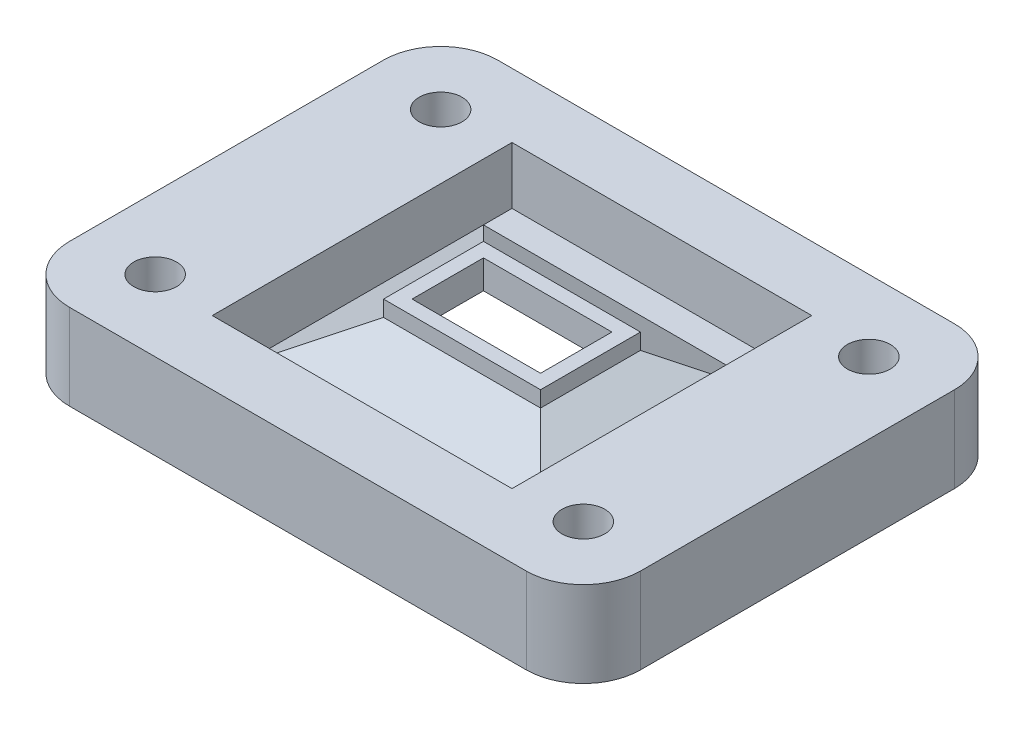
ISO-10303-21;
HEADER;
FILE_DESCRIPTION(('STEP AP214'),'2;1');
FILE_NAME('part.step','',(''),(''),'','','');
FILE_SCHEMA(('AUTOMOTIVE_DESIGN { 1 0 10303 214 1 1 1 1 }'));
ENDSEC;
DATA;
#1=APPLICATION_CONTEXT('core data for automotive mechanical design processes');
#2=APPLICATION_PROTOCOL_DEFINITION('international standard','automotive_design',2000,#1);
#3=PRODUCT_CONTEXT('',#1,'mechanical');
#4=PRODUCT('Part','Part','',(#3));
#5=PRODUCT_RELATED_PRODUCT_CATEGORY('part','',(#4));
#6=PRODUCT_DEFINITION_FORMATION('','',#4);
#7=PRODUCT_DEFINITION_CONTEXT('part definition',#1,'design');
#8=PRODUCT_DEFINITION('design','',#6,#7);
#9=PRODUCT_DEFINITION_SHAPE('','',#8);
#10=(LENGTH_UNIT() NAMED_UNIT(*) SI_UNIT(.MILLI.,.METRE.));
#11=(NAMED_UNIT(*) PLANE_ANGLE_UNIT() SI_UNIT($,.RADIAN.));
#12=(NAMED_UNIT(*) SI_UNIT($,.STERADIAN.) SOLID_ANGLE_UNIT());
#13=UNCERTAINTY_MEASURE_WITH_UNIT(LENGTH_MEASURE(1.E-05),#10,'distance_accuracy_value','');
#14=(GEOMETRIC_REPRESENTATION_CONTEXT(3) GLOBAL_UNCERTAINTY_ASSIGNED_CONTEXT((#13)) GLOBAL_UNIT_ASSIGNED_CONTEXT((#10,
#11,#12)) REPRESENTATION_CONTEXT('',''));
#15=CARTESIAN_POINT('',(0.,0.,0.));
#16=DIRECTION('',(0.,0.,1.));
#17=DIRECTION('',(1.,0.,0.));
#18=AXIS2_PLACEMENT_3D('',#15,#16,#17);
#19=CARTESIAN_POINT('',(0.,2.,0.));
#20=DIRECTION('',(0.,-1.,0.));
#21=DIRECTION('',(0.,0.,-1.));
#22=AXIS2_PLACEMENT_3D('',#19,#20,#21);
#23=PLANE('',#22);
#24=DIRECTION('',(0.,0.,1.));
#25=VECTOR('',#24,1.);
#26=CARTESIAN_POINT('',(9.5,2.,-4.5));
#27=LINE('',#26,#25);
#28=CARTESIAN_POINT('',(9.5,2.,-25.5));
#29=VERTEX_POINT('',#28);
#30=CARTESIAN_POINT('',(9.5,2.,-23.5));
#31=VERTEX_POINT('',#30);
#32=EDGE_CURVE('E251',#29,#31,#27,.T.);
#33=ORIENTED_EDGE('',*,*,#32,.T.);
#34=DIRECTION('',(1.,0.,0.));
#35=VECTOR('',#34,1.);
#36=CARTESIAN_POINT('',(25.5,2.,-23.5));
#37=LINE('',#36,#35);
#38=CARTESIAN_POINT('',(30.5,2.,-23.5));
#39=VERTEX_POINT('',#38);
#40=EDGE_CURVE('E400',#31,#39,#37,.T.);
#41=ORIENTED_EDGE('',*,*,#40,.T.);
#42=DIRECTION('',(0.,0.,-1.));
#43=VECTOR('',#42,1.);
#44=CARTESIAN_POINT('',(30.5,2.,-4.5));
#45=LINE('',#44,#43);
#46=CARTESIAN_POINT('',(30.5,2.,-25.5));
#47=VERTEX_POINT('',#46);
#48=EDGE_CURVE('E259',#39,#47,#45,.T.);
#49=ORIENTED_EDGE('',*,*,#48,.T.);
#50=DIRECTION('',(-1.,0.,0.));
#51=VECTOR('',#50,1.);
#52=CARTESIAN_POINT('',(9.5,2.,-25.5));
#53=LINE('',#52,#51);
#54=EDGE_CURVE('E263',#47,#29,#53,.T.);
#55=ORIENTED_EDGE('',*,*,#54,.T.);
#56=EDGE_LOOP('',(#33,#41,#49,#55));
#57=FACE_BOUND('',#56,.T.);
#58=ADVANCED_FACE('F33',(#57),#23,.F.);
#59=CARTESIAN_POINT('',(30.5,2.,-4.5));
#60=VERTEX_POINT('',#59);
#61=CARTESIAN_POINT('',(30.5,2.,-6.50000000000003));
#62=VERTEX_POINT('',#61);
#63=EDGE_CURVE('E260',#60,#62,#45,.T.);
#64=ORIENTED_EDGE('',*,*,#63,.T.);
#65=DIRECTION('',(-1.,0.,0.));
#66=VECTOR('',#65,1.);
#67=CARTESIAN_POINT('',(14.5,2.,-6.50000000000003));
#68=LINE('',#67,#66);
#69=CARTESIAN_POINT('',(9.5,2.,-6.50000000000003));
#70=VERTEX_POINT('',#69);
#71=EDGE_CURVE('E398',#62,#70,#68,.T.);
#72=ORIENTED_EDGE('',*,*,#71,.T.);
#73=CARTESIAN_POINT('',(9.5,2.,-4.5));
#74=VERTEX_POINT('',#73);
#75=EDGE_CURVE('E256',#70,#74,#27,.T.);
#76=ORIENTED_EDGE('',*,*,#75,.T.);
#77=DIRECTION('',(1.,0.,0.));
#78=VECTOR('',#77,1.);
#79=CARTESIAN_POINT('',(9.5,2.,-4.5));
#80=LINE('',#79,#78);
#81=EDGE_CURVE('E254',#74,#60,#80,.T.);
#82=ORIENTED_EDGE('',*,*,#81,.T.);
#83=EDGE_LOOP('',(#64,#72,#76,#82));
#84=FACE_BOUND('',#83,.T.);
#85=ADVANCED_FACE('F444',(#84),#23,.F.);
#86=CARTESIAN_POINT('',(0.,6.,0.));
#87=DIRECTION('',(1.,0.,0.));
#88=DIRECTION('',(0.,0.,-1.));
#89=AXIS2_PLACEMENT_3D('',#86,#87,#88);
#90=PLANE('',#89);
#91=DIRECTION('',(0.,0.,1.));
#92=VECTOR('',#91,1.);
#93=CARTESIAN_POINT('',(0.,6.,0.));
#94=LINE('',#93,#92);
#95=CARTESIAN_POINT('',(0.,6.,-26.));
#96=VERTEX_POINT('',#95);
#97=CARTESIAN_POINT('',(0.,6.,-4.));
#98=VERTEX_POINT('',#97);
#99=EDGE_CURVE('E311',#96,#98,#94,.T.);
#100=ORIENTED_EDGE('',*,*,#99,.F.);
#101=DIRECTION('',(0.,-1.,0.));
#102=VECTOR('',#101,1.);
#103=CARTESIAN_POINT('',(0.,6.,-26.));
#104=LINE('',#103,#102);
#105=CARTESIAN_POINT('',(0.,0.,-26.));
#106=VERTEX_POINT('',#105);
#107=EDGE_CURVE('E336',#96,#106,#104,.T.);
#108=ORIENTED_EDGE('',*,*,#107,.T.);
#109=DIRECTION('',(0.,0.,1.));
#110=VECTOR('',#109,1.);
#111=CARTESIAN_POINT('',(0.,0.,0.));
#112=LINE('',#111,#110);
#113=CARTESIAN_POINT('',(0.,0.,-4.));
#114=VERTEX_POINT('',#113);
#115=EDGE_CURVE('E310',#106,#114,#112,.T.);
#116=ORIENTED_EDGE('',*,*,#115,.T.);
#117=DIRECTION('',(0.,-1.,0.));
#118=VECTOR('',#117,1.);
#119=CARTESIAN_POINT('',(0.,6.,-4.));
#120=LINE('',#119,#118);
#121=EDGE_CURVE('E324',#114,#98,#120,.F.);
#122=ORIENTED_EDGE('',*,*,#121,.T.);
#123=EDGE_LOOP('',(#100,#108,#116,#122));
#124=FACE_BOUND('',#123,.T.);
#125=ADVANCED_FACE('F476',(#124),#90,.F.);
#126=CARTESIAN_POINT('',(0.,6.,0.));
#127=DIRECTION('',(0.,0.,-1.));
#128=DIRECTION('',(-1.,0.,0.));
#129=AXIS2_PLACEMENT_3D('',#126,#127,#128);
#130=PLANE('',#129);
#131=DIRECTION('',(1.,0.,0.));
#132=VECTOR('',#131,1.);
#133=CARTESIAN_POINT('',(0.,0.,0.));
#134=LINE('',#133,#132);
#135=CARTESIAN_POINT('',(4.,0.,0.));
#136=VERTEX_POINT('',#135);
#137=CARTESIAN_POINT('',(36.,0.,0.));
#138=VERTEX_POINT('',#137);
#139=EDGE_CURVE('E327',#136,#138,#134,.T.);
#140=ORIENTED_EDGE('',*,*,#139,.T.);
#141=DIRECTION('',(0.,-1.,0.));
#142=VECTOR('',#141,1.);
#143=CARTESIAN_POINT('',(36.,6.,0.));
#144=LINE('',#143,#142);
#145=CARTESIAN_POINT('',(36.,6.,0.));
#146=VERTEX_POINT('',#145);
#147=EDGE_CURVE('E368',#138,#146,#144,.F.);
#148=ORIENTED_EDGE('',*,*,#147,.T.);
#149=DIRECTION('',(1.,0.,0.));
#150=VECTOR('',#149,1.);
#151=CARTESIAN_POINT('',(0.,6.,0.));
#152=LINE('',#151,#150);
#153=CARTESIAN_POINT('',(4.,6.,0.));
#154=VERTEX_POINT('',#153);
#155=EDGE_CURVE('E314',#154,#146,#152,.T.);
#156=ORIENTED_EDGE('',*,*,#155,.F.);
#157=DIRECTION('',(0.,-1.,0.));
#158=VECTOR('',#157,1.);
#159=CARTESIAN_POINT('',(4.,6.,0.));
#160=LINE('',#159,#158);
#161=EDGE_CURVE('E365',#154,#136,#160,.T.);
#162=ORIENTED_EDGE('',*,*,#161,.T.);
#163=EDGE_LOOP('',(#140,#148,#156,#162));
#164=FACE_BOUND('',#163,.T.);
#165=ADVANCED_FACE('F487',(#164),#130,.F.);
#166=CARTESIAN_POINT('',(40.,6.,0.));
#167=DIRECTION('',(-1.,0.,0.));
#168=DIRECTION('',(0.,0.,1.));
#169=AXIS2_PLACEMENT_3D('',#166,#167,#168);
#170=PLANE('',#169);
#171=DIRECTION('',(0.,0.,-1.));
#172=VECTOR('',#171,1.);
#173=CARTESIAN_POINT('',(40.,0.,0.));
#174=LINE('',#173,#172);
#175=CARTESIAN_POINT('',(40.,0.,-4.));
#176=VERTEX_POINT('',#175);
#177=CARTESIAN_POINT('',(40.,0.,-26.));
#178=VERTEX_POINT('',#177);
#179=EDGE_CURVE('E330',#176,#178,#174,.T.);
#180=ORIENTED_EDGE('',*,*,#179,.T.);
#181=DIRECTION('',(0.,-1.,0.));
#182=VECTOR('',#181,1.);
#183=CARTESIAN_POINT('',(40.,6.,-26.));
#184=LINE('',#183,#182);
#185=CARTESIAN_POINT('',(40.,6.,-26.));
#186=VERTEX_POINT('',#185);
#187=EDGE_CURVE('E363',#178,#186,#184,.F.);
#188=ORIENTED_EDGE('',*,*,#187,.T.);
#189=DIRECTION('',(0.,0.,-1.));
#190=VECTOR('',#189,1.);
#191=CARTESIAN_POINT('',(40.,6.,0.));
#192=LINE('',#191,#190);
#193=CARTESIAN_POINT('',(40.,6.,-4.));
#194=VERTEX_POINT('',#193);
#195=EDGE_CURVE('E318',#194,#186,#192,.T.);
#196=ORIENTED_EDGE('',*,*,#195,.F.);
#197=DIRECTION('',(0.,-1.,0.));
#198=VECTOR('',#197,1.);
#199=CARTESIAN_POINT('',(40.,6.,-4.));
#200=LINE('',#199,#198);
#201=EDGE_CURVE('E360',#194,#176,#200,.T.);
#202=ORIENTED_EDGE('',*,*,#201,.T.);
#203=EDGE_LOOP('',(#180,#188,#196,#202));
#204=FACE_BOUND('',#203,.T.);
#205=ADVANCED_FACE('F496',(#204),#170,.F.);
#206=CARTESIAN_POINT('',(0.,6.,-30.));
#207=DIRECTION('',(0.,0.,1.));
#208=DIRECTION('',(1.,0.,0.));
#209=AXIS2_PLACEMENT_3D('',#206,#207,#208);
#210=PLANE('',#209);
#211=DIRECTION('',(-1.,0.,0.));
#212=VECTOR('',#211,1.);
#213=CARTESIAN_POINT('',(0.,0.,-30.));
#214=LINE('',#213,#212);
#215=CARTESIAN_POINT('',(36.,0.,-30.));
#216=VERTEX_POINT('',#215);
#217=CARTESIAN_POINT('',(4.,0.,-30.));
#218=VERTEX_POINT('',#217);
#219=EDGE_CURVE('E315',#216,#218,#214,.T.);
#220=ORIENTED_EDGE('',*,*,#219,.T.);
#221=DIRECTION('',(0.,-1.,0.));
#222=VECTOR('',#221,1.);
#223=CARTESIAN_POINT('',(4.,6.,-30.));
#224=LINE('',#223,#222);
#225=CARTESIAN_POINT('',(4.,6.,-30.));
#226=VERTEX_POINT('',#225);
#227=EDGE_CURVE('E350',#218,#226,#224,.F.);
#228=ORIENTED_EDGE('',*,*,#227,.T.);
#229=DIRECTION('',(-1.,0.,0.));
#230=VECTOR('',#229,1.);
#231=CARTESIAN_POINT('',(0.,6.,-30.));
#232=LINE('',#231,#230);
#233=CARTESIAN_POINT('',(36.,6.,-30.));
#234=VERTEX_POINT('',#233);
#235=EDGE_CURVE('E321',#234,#226,#232,.T.);
#236=ORIENTED_EDGE('',*,*,#235,.F.);
#237=DIRECTION('',(0.,-1.,0.));
#238=VECTOR('',#237,1.);
#239=CARTESIAN_POINT('',(36.,6.,-30.));
#240=LINE('',#239,#238);
#241=EDGE_CURVE('E347',#234,#216,#240,.T.);
#242=ORIENTED_EDGE('',*,*,#241,.T.);
#243=EDGE_LOOP('',(#220,#228,#236,#242));
#244=FACE_BOUND('',#243,.T.);
#245=ADVANCED_FACE('F454',(#244),#210,.F.);
#246=CARTESIAN_POINT('',(0.,6.,0.));
#247=DIRECTION('',(0.,-1.,0.));
#248=DIRECTION('',(0.,0.,-1.));
#249=AXIS2_PLACEMENT_3D('',#246,#247,#248);
#250=PLANE('',#249);
#251=DIRECTION('',(1.,0.,0.));
#252=VECTOR('',#251,1.);
#253=CARTESIAN_POINT('',(9.5,6.,-4.5));
#254=LINE('',#253,#252);
#255=CARTESIAN_POINT('',(9.5,6.,-4.5));
#256=VERTEX_POINT('',#255);
#257=CARTESIAN_POINT('',(30.5,6.,-4.5));
#258=VERTEX_POINT('',#257);
#259=EDGE_CURVE('E269',#256,#258,#254,.T.);
#260=ORIENTED_EDGE('',*,*,#259,.F.);
#261=DIRECTION('',(0.,0.,1.));
#262=VECTOR('',#261,1.);
#263=CARTESIAN_POINT('',(9.5,6.,-4.5));
#264=LINE('',#263,#262);
#265=CARTESIAN_POINT('',(9.5,6.,-25.5));
#266=VERTEX_POINT('',#265);
#267=EDGE_CURVE('E208',#266,#256,#264,.T.);
#268=ORIENTED_EDGE('',*,*,#267,.F.);
#269=DIRECTION('',(-1.,0.,0.));
#270=VECTOR('',#269,1.);
#271=CARTESIAN_POINT('',(9.5,6.,-25.5));
#272=LINE('',#271,#270);
#273=CARTESIAN_POINT('',(30.5,6.,-25.5));
#274=VERTEX_POINT('',#273);
#275=EDGE_CURVE('E275',#274,#266,#272,.T.);
#276=ORIENTED_EDGE('',*,*,#275,.F.);
#277=DIRECTION('',(0.,0.,-1.));
#278=VECTOR('',#277,1.);
#279=CARTESIAN_POINT('',(30.5,6.,-4.5));
#280=LINE('',#279,#278);
#281=EDGE_CURVE('E272',#258,#274,#280,.T.);
#282=ORIENTED_EDGE('',*,*,#281,.F.);
#283=EDGE_LOOP('',(#260,#268,#276,#282));
#284=FACE_BOUND('',#283,.T.);
#285=CARTESIAN_POINT('',(5.,6.,-25.));
#286=DIRECTION('',(0.,1.,0.));
#287=DIRECTION('',(0.,0.,-1.));
#288=AXIS2_PLACEMENT_3D('',#285,#286,#287);
#289=CIRCLE('',#288,1.5);
#290=CARTESIAN_POINT('',(5.,6.,-26.5));
#291=VERTEX_POINT('',#290);
#292=EDGE_CURVE('E287',#291,#291,#289,.T.);
#293=ORIENTED_EDGE('',*,*,#292,.F.);
#294=EDGE_LOOP('',(#293));
#295=FACE_BOUND('',#294,.T.);
#296=CARTESIAN_POINT('',(35.,6.,-5.));
#297=DIRECTION('',(0.,1.,0.));
#298=DIRECTION('',(0.,0.,-1.));
#299=AXIS2_PLACEMENT_3D('',#296,#297,#298);
#300=CIRCLE('',#299,1.5);
#301=CARTESIAN_POINT('',(35.,6.,-6.5));
#302=VERTEX_POINT('',#301);
#303=EDGE_CURVE('E295',#302,#302,#300,.T.);
#304=ORIENTED_EDGE('',*,*,#303,.F.);
#305=EDGE_LOOP('',(#304));
#306=FACE_BOUND('',#305,.T.);
#307=CARTESIAN_POINT('',(35.,6.,-25.));
#308=DIRECTION('',(0.,1.,0.));
#309=DIRECTION('',(0.,0.,1.));
#310=AXIS2_PLACEMENT_3D('',#307,#308,#309);
#311=CIRCLE('',#310,1.5);
#312=CARTESIAN_POINT('',(35.,6.,-23.5));
#313=VERTEX_POINT('',#312);
#314=EDGE_CURVE('E280',#313,#313,#311,.T.);
#315=ORIENTED_EDGE('',*,*,#314,.F.);
#316=EDGE_LOOP('',(#315));
#317=FACE_BOUND('',#316,.T.);
#318=CARTESIAN_POINT('',(5.,6.,-5.));
#319=DIRECTION('',(0.,1.,0.));
#320=DIRECTION('',(0.,0.,1.));
#321=AXIS2_PLACEMENT_3D('',#318,#319,#320);
#322=CIRCLE('',#321,1.5);
#323=CARTESIAN_POINT('',(5.,6.,-3.5));
#324=VERTEX_POINT('',#323);
#325=EDGE_CURVE('E294',#324,#324,#322,.T.);
#326=ORIENTED_EDGE('',*,*,#325,.F.);
#327=EDGE_LOOP('',(#326));
#328=FACE_BOUND('',#327,.T.);
#329=ORIENTED_EDGE('',*,*,#235,.T.);
#330=CARTESIAN_POINT('',(4.,6.,-26.));
#331=DIRECTION('',(0.,-1.,0.));
#332=DIRECTION('',(0.,0.,-1.));
#333=AXIS2_PLACEMENT_3D('',#330,#331,#332);
#334=CIRCLE('',#333,4.);
#335=EDGE_CURVE('E358',#226,#96,#334,.F.);
#336=ORIENTED_EDGE('',*,*,#335,.T.);
#337=ORIENTED_EDGE('',*,*,#99,.T.);
#338=CARTESIAN_POINT('',(4.,6.,-4.));
#339=DIRECTION('',(0.,-1.,0.));
#340=DIRECTION('',(0.,0.,-1.));
#341=AXIS2_PLACEMENT_3D('',#338,#339,#340);
#342=CIRCLE('',#341,4.);
#343=EDGE_CURVE('E352',#98,#154,#342,.F.);
#344=ORIENTED_EDGE('',*,*,#343,.T.);
#345=ORIENTED_EDGE('',*,*,#155,.T.);
#346=CARTESIAN_POINT('',(36.,6.,-4.));
#347=DIRECTION('',(0.,-1.,0.));
#348=DIRECTION('',(0.,0.,-1.));
#349=AXIS2_PLACEMENT_3D('',#346,#347,#348);
#350=CIRCLE('',#349,4.);
#351=EDGE_CURVE('E354',#146,#194,#350,.F.);
#352=ORIENTED_EDGE('',*,*,#351,.T.);
#353=ORIENTED_EDGE('',*,*,#195,.T.);
#354=CARTESIAN_POINT('',(36.,6.,-26.));
#355=DIRECTION('',(0.,-1.,0.));
#356=DIRECTION('',(0.,0.,-1.));
#357=AXIS2_PLACEMENT_3D('',#354,#355,#356);
#358=CIRCLE('',#357,4.);
#359=EDGE_CURVE('E356',#186,#234,#358,.F.);
#360=ORIENTED_EDGE('',*,*,#359,.T.);
#361=EDGE_LOOP('',(#329,#336,#337,#344,#345,#352,#353,#360));
#362=FACE_BOUND('',#361,.T.);
#363=ADVANCED_FACE('F450',(#284,#295,#306,#317,#328,#362),#250,.F.);
#364=CARTESIAN_POINT('',(0.,0.,0.));
#365=DIRECTION('',(0.,-1.,0.));
#366=DIRECTION('',(0.,0.,-1.));
#367=AXIS2_PLACEMENT_3D('',#364,#365,#366);
#368=PLANE('',#367);
#369=DIRECTION('',(-1.,0.,0.));
#370=VECTOR('',#369,1.);
#371=CARTESIAN_POINT('',(15.5,0.,-24.4282032302755));
#372=LINE('',#371,#370);
#373=CARTESIAN_POINT('',(31.4282032302755,0.,-24.4282032302755));
#374=VERTEX_POINT('',#373);
#375=CARTESIAN_POINT('',(8.5717967697245,0.,-24.4282032302755));
#376=VERTEX_POINT('',#375);
#377=EDGE_CURVE('E370',#374,#376,#372,.T.);
#378=ORIENTED_EDGE('',*,*,#377,.T.);
#379=DIRECTION('',(0.,0.,1.));
#380=VECTOR('',#379,1.);
#381=CARTESIAN_POINT('',(8.5717967697245,0.,-12.5));
#382=LINE('',#381,#380);
#383=CARTESIAN_POINT('',(8.5717967697245,0.,-5.5717967697245));
#384=VERTEX_POINT('',#383);
#385=EDGE_CURVE('E376',#376,#384,#382,.T.);
#386=ORIENTED_EDGE('',*,*,#385,.T.);
#387=DIRECTION('',(1.,0.,0.));
#388=VECTOR('',#387,1.);
#389=CARTESIAN_POINT('',(24.5,0.,-5.5717967697245));
#390=LINE('',#389,#388);
#391=CARTESIAN_POINT('',(31.4282032302755,0.,-5.5717967697245));
#392=VERTEX_POINT('',#391);
#393=EDGE_CURVE('E374',#384,#392,#390,.T.);
#394=ORIENTED_EDGE('',*,*,#393,.T.);
#395=DIRECTION('',(0.,0.,-1.));
#396=VECTOR('',#395,1.);
#397=CARTESIAN_POINT('',(31.4282032302755,0.,-17.5));
#398=LINE('',#397,#396);
#399=EDGE_CURVE('E372',#392,#374,#398,.T.);
#400=ORIENTED_EDGE('',*,*,#399,.T.);
#401=EDGE_LOOP('',(#378,#386,#394,#400));
#402=FACE_BOUND('',#401,.T.);
#403=CARTESIAN_POINT('',(5.,0.,-25.));
#404=DIRECTION('',(0.,-1.,0.));
#405=DIRECTION('',(0.,0.,-1.));
#406=AXIS2_PLACEMENT_3D('',#403,#404,#405);
#407=CIRCLE('',#406,1.5);
#408=CARTESIAN_POINT('',(5.,0.,-26.5));
#409=VERTEX_POINT('',#408);
#410=EDGE_CURVE('E290',#409,#409,#407,.F.);
#411=ORIENTED_EDGE('',*,*,#410,.T.);
#412=EDGE_LOOP('',(#411));
#413=FACE_BOUND('',#412,.T.);
#414=CARTESIAN_POINT('',(35.,0.,-5.));
#415=DIRECTION('',(0.,-1.,0.));
#416=DIRECTION('',(0.,0.,-1.));
#417=AXIS2_PLACEMENT_3D('',#414,#415,#416);
#418=CIRCLE('',#417,1.5);
#419=CARTESIAN_POINT('',(35.,0.,-6.5));
#420=VERTEX_POINT('',#419);
#421=EDGE_CURVE('E291',#420,#420,#418,.F.);
#422=ORIENTED_EDGE('',*,*,#421,.T.);
#423=EDGE_LOOP('',(#422));
#424=FACE_BOUND('',#423,.T.);
#425=CARTESIAN_POINT('',(35.,0.,-25.));
#426=DIRECTION('',(0.,-1.,0.));
#427=DIRECTION('',(0.,0.,-1.));
#428=AXIS2_PLACEMENT_3D('',#425,#426,#427);
#429=CIRCLE('',#428,1.5);
#430=CARTESIAN_POINT('',(35.,0.,-26.5));
#431=VERTEX_POINT('',#430);
#432=EDGE_CURVE('E298',#431,#431,#429,.F.);
#433=ORIENTED_EDGE('',*,*,#432,.T.);
#434=EDGE_LOOP('',(#433));
#435=FACE_BOUND('',#434,.T.);
#436=CARTESIAN_POINT('',(5.,0.,-5.));
#437=DIRECTION('',(0.,-1.,0.));
#438=DIRECTION('',(0.,0.,-1.));
#439=AXIS2_PLACEMENT_3D('',#436,#437,#438);
#440=CIRCLE('',#439,1.5);
#441=CARTESIAN_POINT('',(5.,0.,-6.5));
#442=VERTEX_POINT('',#441);
#443=EDGE_CURVE('E307',#442,#442,#440,.F.);
#444=ORIENTED_EDGE('',*,*,#443,.T.);
#445=EDGE_LOOP('',(#444));
#446=FACE_BOUND('',#445,.T.);
#447=ORIENTED_EDGE('',*,*,#115,.F.);
#448=CARTESIAN_POINT('',(4.,0.,-26.));
#449=DIRECTION('',(0.,-1.,0.));
#450=DIRECTION('',(0.,0.,-1.));
#451=AXIS2_PLACEMENT_3D('',#448,#449,#450);
#452=CIRCLE('',#451,4.);
#453=EDGE_CURVE('E345',#106,#218,#452,.T.);
#454=ORIENTED_EDGE('',*,*,#453,.T.);
#455=ORIENTED_EDGE('',*,*,#219,.F.);
#456=CARTESIAN_POINT('',(36.,0.,-26.));
#457=DIRECTION('',(0.,-1.,0.));
#458=DIRECTION('',(0.,0.,-1.));
#459=AXIS2_PLACEMENT_3D('',#456,#457,#458);
#460=CIRCLE('',#459,4.);
#461=EDGE_CURVE('E343',#216,#178,#460,.T.);
#462=ORIENTED_EDGE('',*,*,#461,.T.);
#463=ORIENTED_EDGE('',*,*,#179,.F.);
#464=CARTESIAN_POINT('',(36.,0.,-4.));
#465=DIRECTION('',(0.,-1.,0.));
#466=DIRECTION('',(0.,0.,-1.));
#467=AXIS2_PLACEMENT_3D('',#464,#465,#466);
#468=CIRCLE('',#467,4.);
#469=EDGE_CURVE('E341',#176,#138,#468,.T.);
#470=ORIENTED_EDGE('',*,*,#469,.T.);
#471=ORIENTED_EDGE('',*,*,#139,.F.);
#472=CARTESIAN_POINT('',(4.,0.,-4.));
#473=DIRECTION('',(0.,-1.,0.));
#474=DIRECTION('',(0.,0.,-1.));
#475=AXIS2_PLACEMENT_3D('',#472,#473,#474);
#476=CIRCLE('',#475,4.);
#477=EDGE_CURVE('E339',#136,#114,#476,.T.);
#478=ORIENTED_EDGE('',*,*,#477,.T.);
#479=EDGE_LOOP('',(#447,#454,#455,#462,#463,#470,#471,#478));
#480=FACE_BOUND('',#479,.T.);
#481=ADVANCED_FACE('F453',(#402,#413,#424,#435,#446,#480),#368,.T.);
#482=CARTESIAN_POINT('',(5.,-4.24264068711928,-5.));
#483=DIRECTION('',(0.,1.,0.));
#484=DIRECTION('',(0.,0.,1.));
#485=AXIS2_PLACEMENT_3D('',#482,#483,#484);
#486=CYLINDRICAL_SURFACE('',#485,1.5);
#487=ORIENTED_EDGE('',*,*,#325,.T.);
#488=EDGE_LOOP('',(#487));
#489=FACE_BOUND('',#488,.T.);
#490=ORIENTED_EDGE('',*,*,#443,.F.);
#491=EDGE_LOOP('',(#490));
#492=FACE_BOUND('',#491,.T.);
#493=ADVANCED_FACE('F535',(#489,#492),#486,.F.);
#494=CARTESIAN_POINT('',(35.,-4.24264068711928,-25.));
#495=DIRECTION('',(0.,1.,0.));
#496=DIRECTION('',(0.,0.,1.));
#497=AXIS2_PLACEMENT_3D('',#494,#495,#496);
#498=CYLINDRICAL_SURFACE('',#497,1.5);
#499=ORIENTED_EDGE('',*,*,#314,.T.);
#500=EDGE_LOOP('',(#499));
#501=FACE_BOUND('',#500,.T.);
#502=ORIENTED_EDGE('',*,*,#432,.F.);
#503=EDGE_LOOP('',(#502));
#504=FACE_BOUND('',#503,.T.);
#505=ADVANCED_FACE('F531',(#501,#504),#498,.F.);
#506=CARTESIAN_POINT('',(35.,-4.24264068711928,-5.));
#507=DIRECTION('',(0.,1.,0.));
#508=DIRECTION('',(0.,0.,1.));
#509=AXIS2_PLACEMENT_3D('',#506,#507,#508);
#510=CYLINDRICAL_SURFACE('',#509,1.5);
#511=ORIENTED_EDGE('',*,*,#303,.T.);
#512=EDGE_LOOP('',(#511));
#513=FACE_BOUND('',#512,.T.);
#514=ORIENTED_EDGE('',*,*,#421,.F.);
#515=EDGE_LOOP('',(#514));
#516=FACE_BOUND('',#515,.T.);
#517=ADVANCED_FACE('F527',(#513,#516),#510,.F.);
#518=CARTESIAN_POINT('',(5.,-4.24264068711928,-25.));
#519=DIRECTION('',(0.,1.,0.));
#520=DIRECTION('',(0.,0.,1.));
#521=AXIS2_PLACEMENT_3D('',#518,#519,#520);
#522=CYLINDRICAL_SURFACE('',#521,1.5);
#523=ORIENTED_EDGE('',*,*,#292,.T.);
#524=EDGE_LOOP('',(#523));
#525=FACE_BOUND('',#524,.T.);
#526=ORIENTED_EDGE('',*,*,#410,.F.);
#527=EDGE_LOOP('',(#526));
#528=FACE_BOUND('',#527,.T.);
#529=ADVANCED_FACE('F524',(#525,#528),#522,.F.);
#530=CARTESIAN_POINT('',(4.,6.,-26.));
#531=DIRECTION('',(0.,-1.,0.));
#532=DIRECTION('',(0.,0.,-1.));
#533=AXIS2_PLACEMENT_3D('',#530,#531,#532);
#534=CYLINDRICAL_SURFACE('',#533,4.);
#535=ORIENTED_EDGE('',*,*,#335,.F.);
#536=ORIENTED_EDGE('',*,*,#227,.F.);
#537=ORIENTED_EDGE('',*,*,#453,.F.);
#538=ORIENTED_EDGE('',*,*,#107,.F.);
#539=EDGE_LOOP('',(#535,#536,#537,#538));
#540=FACE_BOUND('',#539,.T.);
#541=ADVANCED_FACE('F473',(#540),#534,.T.);
#542=CARTESIAN_POINT('',(36.,6.,-26.));
#543=DIRECTION('',(0.,-1.,0.));
#544=DIRECTION('',(0.,0.,-1.));
#545=AXIS2_PLACEMENT_3D('',#542,#543,#544);
#546=CYLINDRICAL_SURFACE('',#545,4.);
#547=ORIENTED_EDGE('',*,*,#359,.F.);
#548=ORIENTED_EDGE('',*,*,#187,.F.);
#549=ORIENTED_EDGE('',*,*,#461,.F.);
#550=ORIENTED_EDGE('',*,*,#241,.F.);
#551=EDGE_LOOP('',(#547,#548,#549,#550));
#552=FACE_BOUND('',#551,.T.);
#553=ADVANCED_FACE('F499',(#552),#546,.T.);
#554=CARTESIAN_POINT('',(36.,6.,-4.));
#555=DIRECTION('',(0.,-1.,0.));
#556=DIRECTION('',(0.,0.,-1.));
#557=AXIS2_PLACEMENT_3D('',#554,#555,#556);
#558=CYLINDRICAL_SURFACE('',#557,4.);
#559=ORIENTED_EDGE('',*,*,#351,.F.);
#560=ORIENTED_EDGE('',*,*,#147,.F.);
#561=ORIENTED_EDGE('',*,*,#469,.F.);
#562=ORIENTED_EDGE('',*,*,#201,.F.);
#563=EDGE_LOOP('',(#559,#560,#561,#562));
#564=FACE_BOUND('',#563,.T.);
#565=ADVANCED_FACE('F493',(#564),#558,.T.);
#566=CARTESIAN_POINT('',(4.,6.,-4.));
#567=DIRECTION('',(0.,-1.,0.));
#568=DIRECTION('',(0.,0.,-1.));
#569=AXIS2_PLACEMENT_3D('',#566,#567,#568);
#570=CYLINDRICAL_SURFACE('',#569,4.);
#571=ORIENTED_EDGE('',*,*,#343,.F.);
#572=ORIENTED_EDGE('',*,*,#121,.F.);
#573=ORIENTED_EDGE('',*,*,#477,.F.);
#574=ORIENTED_EDGE('',*,*,#161,.F.);
#575=EDGE_LOOP('',(#571,#572,#573,#574));
#576=FACE_BOUND('',#575,.T.);
#577=ADVANCED_FACE('F484',(#576),#570,.T.);
#578=CARTESIAN_POINT('',(9.5,2.,-4.5));
#579=DIRECTION('',(-1.,0.,0.));
#580=DIRECTION('',(0.,0.,1.));
#581=AXIS2_PLACEMENT_3D('',#578,#579,#580);
#582=PLANE('',#581);
#583=ORIENTED_EDGE('',*,*,#267,.T.);
#584=DIRECTION('',(0.,1.,0.));
#585=VECTOR('',#584,1.);
#586=CARTESIAN_POINT('',(9.5,2.,-4.5));
#587=LINE('',#586,#585);
#588=EDGE_CURVE('E267',#74,#256,#587,.T.);
#589=ORIENTED_EDGE('',*,*,#588,.F.);
#590=ORIENTED_EDGE('',*,*,#75,.F.);
#591=EDGE_CURVE('E255',#31,#70,#27,.T.);
#592=ORIENTED_EDGE('',*,*,#591,.F.);
#593=ORIENTED_EDGE('',*,*,#32,.F.);
#594=DIRECTION('',(0.,1.,0.));
#595=VECTOR('',#594,1.);
#596=CARTESIAN_POINT('',(9.5,2.,-25.5));
#597=LINE('',#596,#595);
#598=EDGE_CURVE('E278',#29,#266,#597,.T.);
#599=ORIENTED_EDGE('',*,*,#598,.T.);
#600=EDGE_LOOP('',(#583,#589,#590,#592,#593,#599));
#601=FACE_BOUND('',#600,.T.);
#602=ADVANCED_FACE('F437',(#601),#582,.F.);
#603=CARTESIAN_POINT('',(9.5,2.,-25.5));
#604=DIRECTION('',(0.,0.,-1.));
#605=DIRECTION('',(-1.,0.,0.));
#606=AXIS2_PLACEMENT_3D('',#603,#604,#605);
#607=PLANE('',#606);
#608=ORIENTED_EDGE('',*,*,#275,.T.);
#609=ORIENTED_EDGE('',*,*,#598,.F.);
#610=ORIENTED_EDGE('',*,*,#54,.F.);
#611=DIRECTION('',(0.,1.,0.));
#612=VECTOR('',#611,1.);
#613=CARTESIAN_POINT('',(30.5,2.,-25.5));
#614=LINE('',#613,#612);
#615=EDGE_CURVE('E281',#47,#274,#614,.T.);
#616=ORIENTED_EDGE('',*,*,#615,.T.);
#617=EDGE_LOOP('',(#608,#609,#610,#616));
#618=FACE_BOUND('',#617,.T.);
#619=ADVANCED_FACE('F433',(#618),#607,.F.);
#620=CARTESIAN_POINT('',(30.5,2.,-4.5));
#621=DIRECTION('',(1.,0.,0.));
#622=DIRECTION('',(0.,0.,-1.));
#623=AXIS2_PLACEMENT_3D('',#620,#621,#622);
#624=PLANE('',#623);
#625=ORIENTED_EDGE('',*,*,#281,.T.);
#626=ORIENTED_EDGE('',*,*,#615,.F.);
#627=ORIENTED_EDGE('',*,*,#48,.F.);
#628=EDGE_CURVE('E264',#62,#39,#45,.T.);
#629=ORIENTED_EDGE('',*,*,#628,.F.);
#630=ORIENTED_EDGE('',*,*,#63,.F.);
#631=DIRECTION('',(0.,1.,0.));
#632=VECTOR('',#631,1.);
#633=CARTESIAN_POINT('',(30.5,2.,-4.5));
#634=LINE('',#633,#632);
#635=EDGE_CURVE('E283',#60,#258,#634,.T.);
#636=ORIENTED_EDGE('',*,*,#635,.T.);
#637=EDGE_LOOP('',(#625,#626,#627,#629,#630,#636));
#638=FACE_BOUND('',#637,.T.);
#639=ADVANCED_FACE('F429',(#638),#624,.F.);
#640=CARTESIAN_POINT('',(9.5,2.,-4.5));
#641=DIRECTION('',(0.,0.,1.));
#642=DIRECTION('',(1.,0.,0.));
#643=AXIS2_PLACEMENT_3D('',#640,#641,#642);
#644=PLANE('',#643);
#645=ORIENTED_EDGE('',*,*,#259,.T.);
#646=ORIENTED_EDGE('',*,*,#635,.F.);
#647=ORIENTED_EDGE('',*,*,#81,.F.);
#648=ORIENTED_EDGE('',*,*,#588,.T.);
#649=EDGE_LOOP('',(#645,#646,#647,#648));
#650=FACE_BOUND('',#649,.T.);
#651=ADVANCED_FACE('F448',(#650),#644,.F.);
#652=CARTESIAN_POINT('',(15.5,-10.295630140987,-12.5));
#653=DIRECTION('',(0.,0.,1.));
#654=DIRECTION('',(1.,0.,0.));
#655=AXIS2_PLACEMENT_3D('',#652,#653,#654);
#656=PLANE('',#655);
#657=DIRECTION('',(0.,1.,0.));
#658=VECTOR('',#657,1.);
#659=CARTESIAN_POINT('',(24.5,-10.295630140987,-12.5));
#660=LINE('',#659,#658);
#661=CARTESIAN_POINT('',(24.5,4.00000000000001,-12.5));
#662=VERTEX_POINT('',#661);
#663=CARTESIAN_POINT('',(24.5,6.,-12.5));
#664=VERTEX_POINT('',#663);
#665=EDGE_CURVE('E246',#662,#664,#660,.T.);
#666=ORIENTED_EDGE('',*,*,#665,.F.);
#667=DIRECTION('',(-1.,0.,0.));
#668=VECTOR('',#667,1.);
#669=CARTESIAN_POINT('',(15.5,4.00000000000001,-12.5));
#670=LINE('',#669,#668);
#671=CARTESIAN_POINT('',(15.5,4.00000000000001,-12.5));
#672=VERTEX_POINT('',#671);
#673=EDGE_CURVE('E204',#662,#672,#670,.T.);
#674=ORIENTED_EDGE('',*,*,#673,.T.);
#675=DIRECTION('',(0.,1.,0.));
#676=VECTOR('',#675,1.);
#677=CARTESIAN_POINT('',(15.5,-10.295630140987,-12.5));
#678=LINE('',#677,#676);
#679=CARTESIAN_POINT('',(15.5,6.,-12.5));
#680=VERTEX_POINT('',#679);
#681=EDGE_CURVE('E196',#672,#680,#678,.T.);
#682=ORIENTED_EDGE('',*,*,#681,.T.);
#683=DIRECTION('',(1.,0.,0.));
#684=VECTOR('',#683,1.);
#685=CARTESIAN_POINT('',(15.5,6.,-12.5));
#686=LINE('',#685,#684);
#687=EDGE_CURVE('E201',#680,#664,#686,.T.);
#688=ORIENTED_EDGE('',*,*,#687,.T.);
#689=EDGE_LOOP('',(#666,#674,#682,#688));
#690=FACE_BOUND('',#689,.T.);
#691=ADVANCED_FACE('F199',(#690),#656,.F.);
#692=CARTESIAN_POINT('',(24.5,-10.295630140987,-12.5));
#693=DIRECTION('',(1.,0.,0.));
#694=DIRECTION('',(0.,0.,-1.));
#695=AXIS2_PLACEMENT_3D('',#692,#693,#694);
#696=PLANE('',#695);
#697=DIRECTION('',(0.,1.,0.));
#698=VECTOR('',#697,1.);
#699=CARTESIAN_POINT('',(24.5,-10.295630140987,-17.5));
#700=LINE('',#699,#698);
#701=CARTESIAN_POINT('',(24.5,4.00000000000001,-17.5));
#702=VERTEX_POINT('',#701);
#703=CARTESIAN_POINT('',(24.5,6.,-17.5));
#704=VERTEX_POINT('',#703);
#705=EDGE_CURVE('E248',#702,#704,#700,.T.);
#706=ORIENTED_EDGE('',*,*,#705,.F.);
#707=DIRECTION('',(0.,0.,1.));
#708=VECTOR('',#707,1.);
#709=CARTESIAN_POINT('',(24.5,4.00000000000001,-12.5));
#710=LINE('',#709,#708);
#711=EDGE_CURVE('E382',#702,#662,#710,.T.);
#712=ORIENTED_EDGE('',*,*,#711,.T.);
#713=ORIENTED_EDGE('',*,*,#665,.T.);
#714=DIRECTION('',(0.,0.,-1.));
#715=VECTOR('',#714,1.);
#716=CARTESIAN_POINT('',(24.5,6.,-17.5));
#717=LINE('',#716,#715);
#718=EDGE_CURVE('E222',#664,#704,#717,.T.);
#719=ORIENTED_EDGE('',*,*,#718,.T.);
#720=EDGE_LOOP('',(#706,#712,#713,#719));
#721=FACE_BOUND('',#720,.T.);
#722=ADVANCED_FACE('F577',(#721),#696,.F.);
#723=CARTESIAN_POINT('',(15.5,-10.295630140987,-17.5));
#724=DIRECTION('',(0.,0.,-1.));
#725=DIRECTION('',(-1.,0.,0.));
#726=AXIS2_PLACEMENT_3D('',#723,#724,#725);
#727=PLANE('',#726);
#728=DIRECTION('',(0.,1.,0.));
#729=VECTOR('',#728,1.);
#730=CARTESIAN_POINT('',(15.5,-10.295630140987,-17.5));
#731=LINE('',#730,#729);
#732=CARTESIAN_POINT('',(15.5,4.00000000000001,-17.5));
#733=VERTEX_POINT('',#732);
#734=CARTESIAN_POINT('',(15.5,6.,-17.5));
#735=VERTEX_POINT('',#734);
#736=EDGE_CURVE('E209',#733,#735,#731,.T.);
#737=ORIENTED_EDGE('',*,*,#736,.F.);
#738=DIRECTION('',(1.,0.,0.));
#739=VECTOR('',#738,1.);
#740=CARTESIAN_POINT('',(24.5,4.00000000000001,-17.5));
#741=LINE('',#740,#739);
#742=EDGE_CURVE('E384',#733,#702,#741,.T.);
#743=ORIENTED_EDGE('',*,*,#742,.T.);
#744=ORIENTED_EDGE('',*,*,#705,.T.);
#745=DIRECTION('',(-1.,0.,0.));
#746=VECTOR('',#745,1.);
#747=CARTESIAN_POINT('',(15.5,6.,-17.5));
#748=LINE('',#747,#746);
#749=EDGE_CURVE('E224',#704,#735,#748,.T.);
#750=ORIENTED_EDGE('',*,*,#749,.T.);
#751=EDGE_LOOP('',(#737,#743,#744,#750));
#752=FACE_BOUND('',#751,.T.);
#753=ADVANCED_FACE('F579',(#752),#727,.F.);
#754=CARTESIAN_POINT('',(15.5,-10.295630140987,-12.5));
#755=DIRECTION('',(-1.,0.,0.));
#756=DIRECTION('',(0.,0.,1.));
#757=AXIS2_PLACEMENT_3D('',#754,#755,#756);
#758=PLANE('',#757);
#759=ORIENTED_EDGE('',*,*,#681,.F.);
#760=DIRECTION('',(0.,0.,-1.));
#761=VECTOR('',#760,1.);
#762=CARTESIAN_POINT('',(15.5,4.00000000000001,-17.5));
#763=LINE('',#762,#761);
#764=EDGE_CURVE('E379',#672,#733,#763,.T.);
#765=ORIENTED_EDGE('',*,*,#764,.T.);
#766=ORIENTED_EDGE('',*,*,#736,.T.);
#767=DIRECTION('',(0.,0.,1.));
#768=VECTOR('',#767,1.);
#769=CARTESIAN_POINT('',(15.5,6.,-17.5));
#770=LINE('',#769,#768);
#771=EDGE_CURVE('E212',#735,#680,#770,.T.);
#772=ORIENTED_EDGE('',*,*,#771,.T.);
#773=EDGE_LOOP('',(#759,#765,#766,#772));
#774=FACE_BOUND('',#773,.T.);
#775=ADVANCED_FACE('F213',(#774),#758,.F.);
#776=CARTESIAN_POINT('',(0.,6.,0.));
#777=DIRECTION('',(0.,1.,0.));
#778=DIRECTION('',(0.,0.,1.));
#779=AXIS2_PLACEMENT_3D('',#776,#777,#778);
#780=PLANE('',#779);
#781=DIRECTION('',(0.,0.,1.));
#782=VECTOR('',#781,1.);
#783=CARTESIAN_POINT('',(14.5,6.,-18.5));
#784=LINE('',#783,#782);
#785=CARTESIAN_POINT('',(14.5,6.,-18.5));
#786=VERTEX_POINT('',#785);
#787=CARTESIAN_POINT('',(14.5,6.,-11.5));
#788=VERTEX_POINT('',#787);
#789=EDGE_CURVE('E228',#786,#788,#784,.T.);
#790=ORIENTED_EDGE('',*,*,#789,.T.);
#791=DIRECTION('',(1.,0.,0.));
#792=VECTOR('',#791,1.);
#793=CARTESIAN_POINT('',(14.5,6.,-11.5));
#794=LINE('',#793,#792);
#795=CARTESIAN_POINT('',(25.5,6.,-11.5));
#796=VERTEX_POINT('',#795);
#797=EDGE_CURVE('E231',#788,#796,#794,.T.);
#798=ORIENTED_EDGE('',*,*,#797,.T.);
#799=DIRECTION('',(0.,0.,-1.));
#800=VECTOR('',#799,1.);
#801=CARTESIAN_POINT('',(25.5,6.,-11.5));
#802=LINE('',#801,#800);
#803=CARTESIAN_POINT('',(25.5,6.,-18.5));
#804=VERTEX_POINT('',#803);
#805=EDGE_CURVE('E233',#796,#804,#802,.T.);
#806=ORIENTED_EDGE('',*,*,#805,.T.);
#807=DIRECTION('',(-1.,0.,0.));
#808=VECTOR('',#807,1.);
#809=CARTESIAN_POINT('',(25.5,6.,-18.5));
#810=LINE('',#809,#808);
#811=EDGE_CURVE('E235',#804,#786,#810,.T.);
#812=ORIENTED_EDGE('',*,*,#811,.T.);
#813=EDGE_LOOP('',(#790,#798,#806,#812));
#814=FACE_BOUND('',#813,.T.);
#815=ORIENTED_EDGE('',*,*,#687,.F.);
#816=ORIENTED_EDGE('',*,*,#771,.F.);
#817=ORIENTED_EDGE('',*,*,#749,.F.);
#818=ORIENTED_EDGE('',*,*,#718,.F.);
#819=EDGE_LOOP('',(#815,#816,#817,#818));
#820=FACE_BOUND('',#819,.T.);
#821=ADVANCED_FACE('F220',(#814,#820),#780,.T.);
#822=CARTESIAN_POINT('',(14.5,6.,-18.5));
#823=DIRECTION('',(1.,0.,0.));
#824=DIRECTION('',(0.,0.,-1.));
#825=AXIS2_PLACEMENT_3D('',#822,#823,#824);
#826=PLANE('',#825);
#827=DIRECTION('',(0.,-1.,0.));
#828=VECTOR('',#827,1.);
#829=CARTESIAN_POINT('',(14.5,6.,-18.5));
#830=LINE('',#829,#828);
#831=CARTESIAN_POINT('',(14.5,4.88675134594814,-18.5));
#832=VERTEX_POINT('',#831);
#833=EDGE_CURVE('E237',#786,#832,#830,.T.);
#834=ORIENTED_EDGE('',*,*,#833,.T.);
#835=DIRECTION('',(0.,0.,1.));
#836=VECTOR('',#835,1.);
#837=CARTESIAN_POINT('',(14.5,4.88675134594814,-11.5));
#838=LINE('',#837,#836);
#839=CARTESIAN_POINT('',(14.5,4.88675134594814,-11.5));
#840=VERTEX_POINT('',#839);
#841=EDGE_CURVE('E386',#832,#840,#838,.T.);
#842=ORIENTED_EDGE('',*,*,#841,.T.);
#843=DIRECTION('',(0.,-1.,0.));
#844=VECTOR('',#843,1.);
#845=CARTESIAN_POINT('',(14.5,6.,-11.5));
#846=LINE('',#845,#844);
#847=EDGE_CURVE('E244',#788,#840,#846,.T.);
#848=ORIENTED_EDGE('',*,*,#847,.F.);
#849=ORIENTED_EDGE('',*,*,#789,.F.);
#850=EDGE_LOOP('',(#834,#842,#848,#849));
#851=FACE_BOUND('',#850,.T.);
#852=ADVANCED_FACE('F588',(#851),#826,.F.);
#853=CARTESIAN_POINT('',(14.5,6.,-11.5));
#854=DIRECTION('',(0.,0.,-1.));
#855=DIRECTION('',(-1.,0.,0.));
#856=AXIS2_PLACEMENT_3D('',#853,#854,#855);
#857=PLANE('',#856);
#858=ORIENTED_EDGE('',*,*,#847,.T.);
#859=DIRECTION('',(1.,0.,0.));
#860=VECTOR('',#859,1.);
#861=CARTESIAN_POINT('',(25.5,4.88675134594814,-11.5));
#862=LINE('',#861,#860);
#863=CARTESIAN_POINT('',(25.5,4.88675134594814,-11.5));
#864=VERTEX_POINT('',#863);
#865=EDGE_CURVE('E11',#840,#864,#862,.T.);
#866=ORIENTED_EDGE('',*,*,#865,.T.);
#867=DIRECTION('',(0.,-1.,0.));
#868=VECTOR('',#867,1.);
#869=CARTESIAN_POINT('',(25.5,6.,-11.5));
#870=LINE('',#869,#868);
#871=EDGE_CURVE('E242',#796,#864,#870,.T.);
#872=ORIENTED_EDGE('',*,*,#871,.F.);
#873=ORIENTED_EDGE('',*,*,#797,.F.);
#874=EDGE_LOOP('',(#858,#866,#872,#873));
#875=FACE_BOUND('',#874,.T.);
#876=ADVANCED_FACE('F591',(#875),#857,.F.);
#877=CARTESIAN_POINT('',(25.5,6.,-11.5));
#878=DIRECTION('',(-1.,0.,0.));
#879=DIRECTION('',(0.,0.,1.));
#880=AXIS2_PLACEMENT_3D('',#877,#878,#879);
#881=PLANE('',#880);
#882=ORIENTED_EDGE('',*,*,#871,.T.);
#883=DIRECTION('',(0.,0.,-1.));
#884=VECTOR('',#883,1.);
#885=CARTESIAN_POINT('',(25.5,4.88675134594814,-18.5));
#886=LINE('',#885,#884);
#887=CARTESIAN_POINT('',(25.5,4.88675134594814,-18.5));
#888=VERTEX_POINT('',#887);
#889=EDGE_CURVE('E42',#864,#888,#886,.T.);
#890=ORIENTED_EDGE('',*,*,#889,.T.);
#891=DIRECTION('',(0.,-1.,0.));
#892=VECTOR('',#891,1.);
#893=CARTESIAN_POINT('',(25.5,6.,-18.5));
#894=LINE('',#893,#892);
#895=EDGE_CURVE('E240',#804,#888,#894,.T.);
#896=ORIENTED_EDGE('',*,*,#895,.F.);
#897=ORIENTED_EDGE('',*,*,#805,.F.);
#898=EDGE_LOOP('',(#882,#890,#896,#897));
#899=FACE_BOUND('',#898,.T.);
#900=ADVANCED_FACE('F595',(#899),#881,.F.);
#901=CARTESIAN_POINT('',(25.5,6.,-18.5));
#902=DIRECTION('',(0.,0.,1.));
#903=DIRECTION('',(1.,0.,0.));
#904=AXIS2_PLACEMENT_3D('',#901,#902,#903);
#905=PLANE('',#904);
#906=ORIENTED_EDGE('',*,*,#895,.T.);
#907=DIRECTION('',(-1.,0.,0.));
#908=VECTOR('',#907,1.);
#909=CARTESIAN_POINT('',(14.5,4.88675134594814,-18.5));
#910=LINE('',#909,#908);
#911=EDGE_CURVE('E402',#888,#832,#910,.T.);
#912=ORIENTED_EDGE('',*,*,#911,.T.);
#913=ORIENTED_EDGE('',*,*,#833,.F.);
#914=ORIENTED_EDGE('',*,*,#811,.F.);
#915=EDGE_LOOP('',(#906,#912,#913,#914));
#916=FACE_BOUND('',#915,.T.);
#917=ADVANCED_FACE('F598',(#916),#905,.F.);
#918=CARTESIAN_POINT('',(31.4282032302755,0.,0.));
#919=DIRECTION('',(-0.500000000000001,-0.866025403784438,0.));
#920=DIRECTION('',(0.,0.,1.));
#921=AXIS2_PLACEMENT_3D('',#918,#919,#920);
#922=PLANE('',#921);
#923=DIRECTION('',(-0.654653670707977,0.377964473009228,-0.654653670707977));
#924=VECTOR('',#923,1.);
#925=CARTESIAN_POINT('',(17.9589732744432,7.7764635407768,-19.0410267255568));
#926=LINE('',#925,#924);
#927=EDGE_CURVE('E391',#662,#392,#926,.F.);
#928=ORIENTED_EDGE('',*,*,#927,.F.);
#929=ORIENTED_EDGE('',*,*,#711,.F.);
#930=DIRECTION('',(-0.654653670707977,0.377964473009228,0.654653670707977));
#931=VECTOR('',#930,1.);
#932=CARTESIAN_POINT('',(20.9589732744432,6.04441273320792,-13.9589732744432));
#933=LINE('',#932,#931);
#934=EDGE_CURVE('E218',#374,#702,#933,.T.);
#935=ORIENTED_EDGE('',*,*,#934,.F.);
#936=ORIENTED_EDGE('',*,*,#399,.F.);
#937=EDGE_LOOP('',(#928,#929,#935,#936));
#938=FACE_BOUND('',#937,.T.);
#939=ADVANCED_FACE('F573',(#938),#922,.T.);
#940=CARTESIAN_POINT('',(0.,0.,-24.4282032302755));
#941=DIRECTION('',(0.,-0.866025403784438,0.500000000000001));
#942=DIRECTION('',(1.,0.,0.));
#943=AXIS2_PLACEMENT_3D('',#940,#941,#942);
#944=PLANE('',#943);
#945=ORIENTED_EDGE('',*,*,#934,.T.);
#946=ORIENTED_EDGE('',*,*,#742,.F.);
#947=DIRECTION('',(-0.654653670707977,-0.377964473009228,-0.654653670707977));
#948=VECTOR('',#947,1.);
#949=CARTESIAN_POINT('',(19.0410267255569,6.04441273320792,-13.9589732744432));
#950=LINE('',#949,#948);
#951=EDGE_CURVE('E389',#376,#733,#950,.F.);
#952=ORIENTED_EDGE('',*,*,#951,.F.);
#953=ORIENTED_EDGE('',*,*,#377,.F.);
#954=EDGE_LOOP('',(#945,#946,#952,#953));
#955=FACE_BOUND('',#954,.T.);
#956=ADVANCED_FACE('F564',(#955),#944,.T.);
#957=CARTESIAN_POINT('',(0.,0.,-5.5717967697245));
#958=DIRECTION('',(0.,-0.866025403784438,-0.500000000000001));
#959=DIRECTION('',(-1.,0.,0.));
#960=AXIS2_PLACEMENT_3D('',#957,#958,#959);
#961=PLANE('',#960);
#962=ORIENTED_EDGE('',*,*,#927,.T.);
#963=ORIENTED_EDGE('',*,*,#393,.F.);
#964=DIRECTION('',(0.654653670707977,0.377964473009228,-0.654653670707977));
#965=VECTOR('',#964,1.);
#966=CARTESIAN_POINT('',(6.18388386841401,-1.378662156373,-3.183883868414));
#967=LINE('',#966,#965);
#968=EDGE_CURVE('E387',#672,#384,#967,.F.);
#969=ORIENTED_EDGE('',*,*,#968,.F.);
#970=ORIENTED_EDGE('',*,*,#673,.F.);
#971=EDGE_LOOP('',(#962,#963,#969,#970));
#972=FACE_BOUND('',#971,.T.);
#973=ADVANCED_FACE('F570',(#972),#961,.T.);
#974=CARTESIAN_POINT('',(8.5717967697245,0.,0.));
#975=DIRECTION('',(0.500000000000001,-0.866025403784438,0.));
#976=DIRECTION('',(0.,0.,-1.));
#977=AXIS2_PLACEMENT_3D('',#974,#975,#976);
#978=PLANE('',#977);
#979=ORIENTED_EDGE('',*,*,#951,.T.);
#980=ORIENTED_EDGE('',*,*,#764,.F.);
#981=ORIENTED_EDGE('',*,*,#968,.T.);
#982=ORIENTED_EDGE('',*,*,#385,.F.);
#983=EDGE_LOOP('',(#979,#980,#981,#982));
#984=FACE_BOUND('',#983,.T.);
#985=ADVANCED_FACE('F566',(#984),#978,.T.);
#986=CARTESIAN_POINT('',(25.5,4.88675134594814,-11.5));
#987=DIRECTION('',(0.500000000000004,0.866025403784436,0.));
#988=DIRECTION('',(0.,0.,1.));
#989=AXIS2_PLACEMENT_3D('',#986,#987,#988);
#990=PLANE('',#989);
#991=DIRECTION('',(-0.654653670707976,0.377964473009231,-0.654653670707976));
#992=VECTOR('',#991,1.);
#993=CARTESIAN_POINT('',(20.7857142857143,7.60854547212783,-16.2142857142857));
#994=LINE('',#993,#992);
#995=EDGE_CURVE('E408',#62,#864,#994,.T.);
#996=ORIENTED_EDGE('',*,*,#995,.F.);
#997=ORIENTED_EDGE('',*,*,#628,.T.);
#998=DIRECTION('',(-0.654653670707976,0.377964473009231,0.654653670707976));
#999=VECTOR('',#998,1.);
#1000=CARTESIAN_POINT('',(22.5,6.61880215351703,-15.5));
#1001=LINE('',#1000,#999);
#1002=EDGE_CURVE('E37',#888,#39,#1001,.F.);
#1003=ORIENTED_EDGE('',*,*,#1002,.F.);
#1004=ORIENTED_EDGE('',*,*,#889,.F.);
#1005=EDGE_LOOP('',(#996,#997,#1003,#1004));
#1006=FACE_BOUND('',#1005,.T.);
#1007=ADVANCED_FACE('F35',(#1006),#990,.T.);
#1008=CARTESIAN_POINT('',(25.5,4.88675134594814,-18.5));
#1009=DIRECTION('',(0.,0.866025403784436,-0.500000000000004));
#1010=DIRECTION('',(1.,0.,0.));
#1011=AXIS2_PLACEMENT_3D('',#1008,#1009,#1010);
#1012=PLANE('',#1011);
#1013=ORIENTED_EDGE('',*,*,#1002,.T.);
#1014=ORIENTED_EDGE('',*,*,#40,.F.);
#1015=DIRECTION('',(0.654653670707976,0.377964473009231,0.654653670707976));
#1016=VECTOR('',#1015,1.);
#1017=CARTESIAN_POINT('',(19.2142857142857,7.60854547212783,-13.7857142857143));
#1018=LINE('',#1017,#1016);
#1019=EDGE_CURVE('E407',#832,#31,#1018,.F.);
#1020=ORIENTED_EDGE('',*,*,#1019,.F.);
#1021=ORIENTED_EDGE('',*,*,#911,.F.);
#1022=EDGE_LOOP('',(#1013,#1014,#1020,#1021));
#1023=FACE_BOUND('',#1022,.T.);
#1024=ADVANCED_FACE('F418',(#1023),#1012,.T.);
#1025=CARTESIAN_POINT('',(14.5,4.88675134594814,-11.5));
#1026=DIRECTION('',(0.,0.866025403784436,0.500000000000004));
#1027=DIRECTION('',(-1.,0.,0.));
#1028=AXIS2_PLACEMENT_3D('',#1025,#1026,#1027);
#1029=PLANE('',#1028);
#1030=ORIENTED_EDGE('',*,*,#995,.T.);
#1031=ORIENTED_EDGE('',*,*,#865,.F.);
#1032=DIRECTION('',(-0.654653670707976,-0.377964473009231,0.654653670707976));
#1033=VECTOR('',#1032,1.);
#1034=CARTESIAN_POINT('',(14.5,4.88675134594814,-11.5));
#1035=LINE('',#1034,#1033);
#1036=EDGE_CURVE('E405',#70,#840,#1035,.F.);
#1037=ORIENTED_EDGE('',*,*,#1036,.F.);
#1038=ORIENTED_EDGE('',*,*,#71,.F.);
#1039=EDGE_LOOP('',(#1030,#1031,#1037,#1038));
#1040=FACE_BOUND('',#1039,.T.);
#1041=ADVANCED_FACE('F612',(#1040),#1029,.T.);
#1042=CARTESIAN_POINT('',(14.5,4.88675134594814,-18.5));
#1043=DIRECTION('',(-0.500000000000004,0.866025403784436,0.));
#1044=DIRECTION('',(0.,0.,-1.));
#1045=AXIS2_PLACEMENT_3D('',#1042,#1043,#1044);
#1046=PLANE('',#1045);
#1047=ORIENTED_EDGE('',*,*,#1019,.T.);
#1048=ORIENTED_EDGE('',*,*,#591,.T.);
#1049=ORIENTED_EDGE('',*,*,#1036,.T.);
#1050=ORIENTED_EDGE('',*,*,#841,.F.);
#1051=EDGE_LOOP('',(#1047,#1048,#1049,#1050));
#1052=FACE_BOUND('',#1051,.T.);
#1053=ADVANCED_FACE('F611',(#1052),#1046,.T.);
#1054=CLOSED_SHELL('',(#58,#85,#125,#165,#205,#245,#363,#481,#493,#505,#517,#529,#541,#553,#565,
#577,#602,#619,#639,#651,#691,#722,#753,#775,#821,#852,#876,#900,#917,#939,#956,#973,#985,#1007,
#1024,#1041,#1053));
#1055=MANIFOLD_SOLID_BREP('B2',#1054);
#1056=ADVANCED_BREP_SHAPE_REPRESENTATION('',(#18,#1055),#14);
#1057=SHAPE_DEFINITION_REPRESENTATION(#9,#1056);
ENDSEC;
END-ISO-10303-21;
